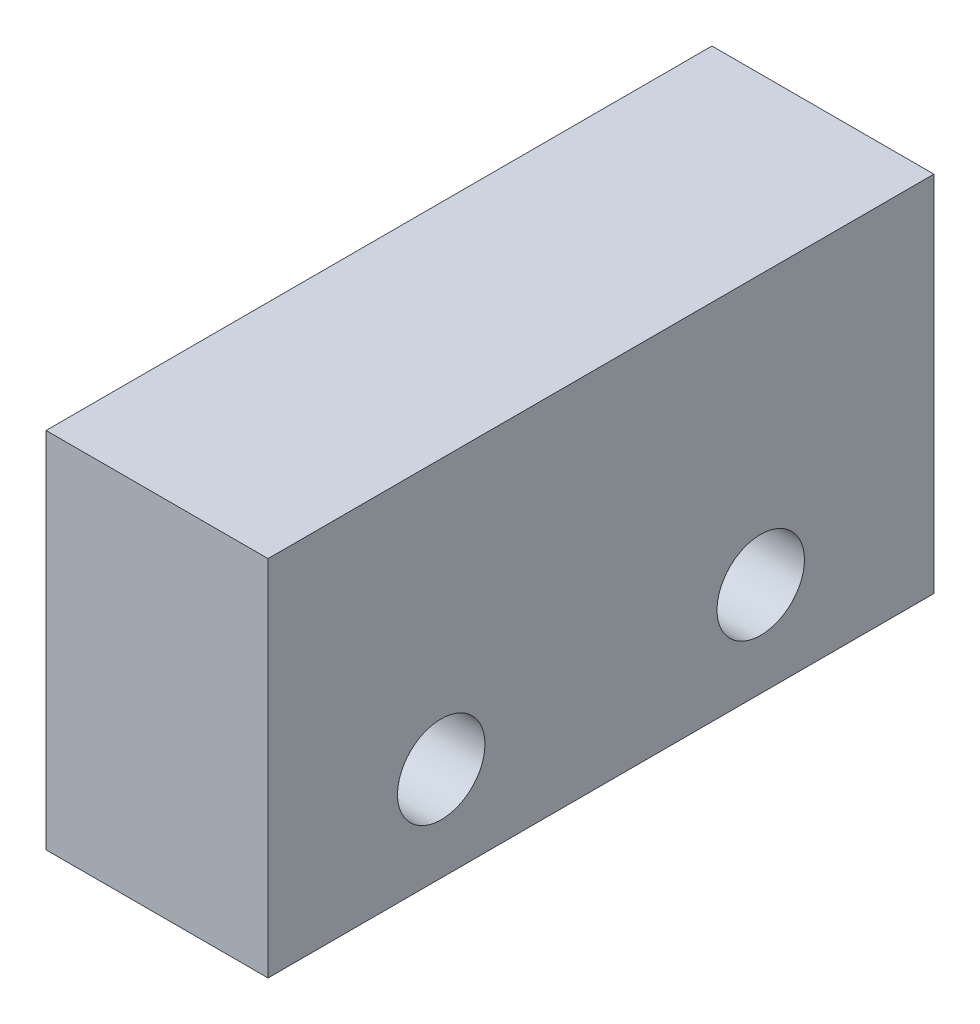
ISO-10303-21;
HEADER;
FILE_DESCRIPTION(('STEP AP214'),'2;1');
FILE_NAME('part.step','',(''),(''),'','','');
FILE_SCHEMA(('AUTOMOTIVE_DESIGN { 1 0 10303 214 1 1 1 1 }'));
ENDSEC;
DATA;
#1=APPLICATION_CONTEXT('core data for automotive mechanical design processes');
#2=APPLICATION_PROTOCOL_DEFINITION('international standard','automotive_design',2000,#1);
#3=PRODUCT_CONTEXT('',#1,'mechanical');
#4=PRODUCT('Part','Part','',(#3));
#5=PRODUCT_RELATED_PRODUCT_CATEGORY('part','',(#4));
#6=PRODUCT_DEFINITION_FORMATION('','',#4);
#7=PRODUCT_DEFINITION_CONTEXT('part definition',#1,'design');
#8=PRODUCT_DEFINITION('design','',#6,#7);
#9=PRODUCT_DEFINITION_SHAPE('','',#8);
#10=(LENGTH_UNIT() NAMED_UNIT(*) SI_UNIT(.MILLI.,.METRE.));
#11=(NAMED_UNIT(*) PLANE_ANGLE_UNIT() SI_UNIT($,.RADIAN.));
#12=(NAMED_UNIT(*) SI_UNIT($,.STERADIAN.) SOLID_ANGLE_UNIT());
#13=UNCERTAINTY_MEASURE_WITH_UNIT(LENGTH_MEASURE(1.E-05),#10,'distance_accuracy_value','');
#14=(GEOMETRIC_REPRESENTATION_CONTEXT(3) GLOBAL_UNCERTAINTY_ASSIGNED_CONTEXT((#13)) GLOBAL_UNIT_ASSIGNED_CONTEXT((#10,
#11,#12)) REPRESENTATION_CONTEXT('',''));
#15=CARTESIAN_POINT('',(0.,0.,0.));
#16=DIRECTION('',(0.,0.,1.));
#17=DIRECTION('',(1.,0.,0.));
#18=AXIS2_PLACEMENT_3D('',#15,#16,#17);
#19=CARTESIAN_POINT('',(6.6,0.,0.));
#20=DIRECTION('',(0.,0.,-1.));
#21=DIRECTION('',(0.,1.,0.));
#22=AXIS2_PLACEMENT_3D('',#19,#20,#21);
#23=PLANE('',#22);
#24=DIRECTION('',(0.,-1.,0.));
#25=VECTOR('',#24,1.);
#26=CARTESIAN_POINT('',(0.,0.,0.));
#27=LINE('',#26,#25);
#28=CARTESIAN_POINT('',(0.,0.,0.));
#29=VERTEX_POINT('',#28);
#30=CARTESIAN_POINT('',(0.,-10.8,0.));
#31=VERTEX_POINT('',#30);
#32=EDGE_CURVE('E98',#29,#31,#27,.T.);
#33=ORIENTED_EDGE('',*,*,#32,.T.);
#34=DIRECTION('',(-1.,0.,0.));
#35=VECTOR('',#34,1.);
#36=CARTESIAN_POINT('',(6.6,-10.8,0.));
#37=LINE('',#36,#35);
#38=CARTESIAN_POINT('',(6.6,-10.8,0.));
#39=VERTEX_POINT('',#38);
#40=EDGE_CURVE('E11',#39,#31,#37,.T.);
#41=ORIENTED_EDGE('',*,*,#40,.F.);
#42=DIRECTION('',(0.,-1.,0.));
#43=VECTOR('',#42,1.);
#44=CARTESIAN_POINT('',(6.6,0.,0.));
#45=LINE('',#44,#43);
#46=CARTESIAN_POINT('',(6.6,0.,0.));
#47=VERTEX_POINT('',#46);
#48=EDGE_CURVE('E86',#47,#39,#45,.T.);
#49=ORIENTED_EDGE('',*,*,#48,.F.);
#50=DIRECTION('',(-1.,0.,0.));
#51=VECTOR('',#50,1.);
#52=CARTESIAN_POINT('',(6.6,0.,0.));
#53=LINE('',#52,#51);
#54=EDGE_CURVE('E94',#47,#29,#53,.T.);
#55=ORIENTED_EDGE('',*,*,#54,.T.);
#56=EDGE_LOOP('',(#33,#41,#49,#55));
#57=FACE_BOUND('',#56,.T.);
#58=ADVANCED_FACE('F35',(#57),#23,.F.);
#59=CARTESIAN_POINT('',(6.6,-10.8,0.));
#60=DIRECTION('',(0.,1.,0.));
#61=DIRECTION('',(0.,0.,1.));
#62=AXIS2_PLACEMENT_3D('',#59,#60,#61);
#63=PLANE('',#62);
#64=DIRECTION('',(0.,0.,-1.));
#65=VECTOR('',#64,1.);
#66=CARTESIAN_POINT('',(0.,-10.8,0.));
#67=LINE('',#66,#65);
#68=CARTESIAN_POINT('',(0.,-10.8,-19.8));
#69=VERTEX_POINT('',#68);
#70=EDGE_CURVE('E90',#31,#69,#67,.T.);
#71=ORIENTED_EDGE('',*,*,#70,.T.);
#72=DIRECTION('',(-1.,0.,0.));
#73=VECTOR('',#72,1.);
#74=CARTESIAN_POINT('',(6.6,-10.8,-19.8));
#75=LINE('',#74,#73);
#76=CARTESIAN_POINT('',(6.6,-10.8,-19.8));
#77=VERTEX_POINT('',#76);
#78=EDGE_CURVE('E43',#77,#69,#75,.T.);
#79=ORIENTED_EDGE('',*,*,#78,.F.);
#80=DIRECTION('',(0.,0.,-1.));
#81=VECTOR('',#80,1.);
#82=CARTESIAN_POINT('',(6.6,-10.8,0.));
#83=LINE('',#82,#81);
#84=EDGE_CURVE('E81',#39,#77,#83,.T.);
#85=ORIENTED_EDGE('',*,*,#84,.F.);
#86=ORIENTED_EDGE('',*,*,#40,.T.);
#87=EDGE_LOOP('',(#71,#79,#85,#86));
#88=FACE_BOUND('',#87,.T.);
#89=ADVANCED_FACE('F89',(#88),#63,.F.);
#90=CARTESIAN_POINT('',(6.6,0.,-19.8));
#91=DIRECTION('',(0.,0.,1.));
#92=DIRECTION('',(1.,0.,0.));
#93=AXIS2_PLACEMENT_3D('',#90,#91,#92);
#94=PLANE('',#93);
#95=DIRECTION('',(0.,1.,0.));
#96=VECTOR('',#95,1.);
#97=CARTESIAN_POINT('',(0.,0.,-19.8));
#98=LINE('',#97,#96);
#99=CARTESIAN_POINT('',(0.,0.,-19.8));
#100=VERTEX_POINT('',#99);
#101=EDGE_CURVE('E68',#69,#100,#98,.T.);
#102=ORIENTED_EDGE('',*,*,#101,.T.);
#103=DIRECTION('',(-1.,0.,0.));
#104=VECTOR('',#103,1.);
#105=CARTESIAN_POINT('',(6.6,0.,-19.8));
#106=LINE('',#105,#104);
#107=CARTESIAN_POINT('',(6.6,0.,-19.8));
#108=VERTEX_POINT('',#107);
#109=EDGE_CURVE('E91',#108,#100,#106,.T.);
#110=ORIENTED_EDGE('',*,*,#109,.F.);
#111=DIRECTION('',(0.,1.,0.));
#112=VECTOR('',#111,1.);
#113=CARTESIAN_POINT('',(6.6,0.,-19.8));
#114=LINE('',#113,#112);
#115=EDGE_CURVE('E84',#77,#108,#114,.T.);
#116=ORIENTED_EDGE('',*,*,#115,.F.);
#117=ORIENTED_EDGE('',*,*,#78,.T.);
#118=EDGE_LOOP('',(#102,#110,#116,#117));
#119=FACE_BOUND('',#118,.T.);
#120=ADVANCED_FACE('F92',(#119),#94,.F.);
#121=CARTESIAN_POINT('',(6.6,0.,0.));
#122=DIRECTION('',(0.,-1.,0.));
#123=DIRECTION('',(0.,0.,-1.));
#124=AXIS2_PLACEMENT_3D('',#121,#122,#123);
#125=PLANE('',#124);
#126=DIRECTION('',(0.,0.,1.));
#127=VECTOR('',#126,1.);
#128=CARTESIAN_POINT('',(0.,0.,0.));
#129=LINE('',#128,#127);
#130=EDGE_CURVE('E74',#100,#29,#129,.T.);
#131=ORIENTED_EDGE('',*,*,#130,.T.);
#132=ORIENTED_EDGE('',*,*,#54,.F.);
#133=DIRECTION('',(0.,0.,1.));
#134=VECTOR('',#133,1.);
#135=CARTESIAN_POINT('',(6.6,0.,0.));
#136=LINE('',#135,#134);
#137=EDGE_CURVE('E51',#108,#47,#136,.T.);
#138=ORIENTED_EDGE('',*,*,#137,.F.);
#139=ORIENTED_EDGE('',*,*,#109,.T.);
#140=EDGE_LOOP('',(#131,#132,#138,#139));
#141=FACE_BOUND('',#140,.T.);
#142=ADVANCED_FACE('F106',(#141),#125,.F.);
#143=CARTESIAN_POINT('',(6.6,0.,0.));
#144=DIRECTION('',(1.,0.,0.));
#145=DIRECTION('',(0.,0.,-1.));
#146=AXIS2_PLACEMENT_3D('',#143,#144,#145);
#147=PLANE('',#146);
#148=CARTESIAN_POINT('',(6.6,-8.,-14.65));
#149=DIRECTION('',(1.,0.,0.));
#150=DIRECTION('',(0.,0.,-1.));
#151=AXIS2_PLACEMENT_3D('',#148,#149,#150);
#152=CIRCLE('',#151,1.3);
#153=CARTESIAN_POINT('',(6.6,-8.,-15.95));
#154=VERTEX_POINT('',#153);
#155=EDGE_CURVE('E118',#154,#154,#152,.T.);
#156=ORIENTED_EDGE('',*,*,#155,.F.);
#157=EDGE_LOOP('',(#156));
#158=FACE_BOUND('',#157,.T.);
#159=CARTESIAN_POINT('',(6.6,-8.,-5.15));
#160=DIRECTION('',(1.,0.,0.));
#161=DIRECTION('',(0.,0.,-1.));
#162=AXIS2_PLACEMENT_3D('',#159,#160,#161);
#163=CIRCLE('',#162,1.3);
#164=CARTESIAN_POINT('',(6.6,-8.,-6.45));
#165=VERTEX_POINT('',#164);
#166=EDGE_CURVE('E112',#165,#165,#163,.T.);
#167=ORIENTED_EDGE('',*,*,#166,.F.);
#168=EDGE_LOOP('',(#167));
#169=FACE_BOUND('',#168,.T.);
#170=ORIENTED_EDGE('',*,*,#48,.T.);
#171=ORIENTED_EDGE('',*,*,#84,.T.);
#172=ORIENTED_EDGE('',*,*,#115,.T.);
#173=ORIENTED_EDGE('',*,*,#137,.T.);
#174=EDGE_LOOP('',(#170,#171,#172,#173));
#175=FACE_BOUND('',#174,.T.);
#176=ADVANCED_FACE('F82',(#158,#169,#175),#147,.T.);
#177=CARTESIAN_POINT('',(0.,0.,0.));
#178=DIRECTION('',(1.,0.,0.));
#179=DIRECTION('',(0.,0.,-1.));
#180=AXIS2_PLACEMENT_3D('',#177,#178,#179);
#181=PLANE('',#180);
#182=CARTESIAN_POINT('',(0.,-8.,-14.65));
#183=DIRECTION('',(1.,0.,0.));
#184=DIRECTION('',(0.,0.,-1.));
#185=AXIS2_PLACEMENT_3D('',#182,#183,#184);
#186=CIRCLE('',#185,1.3);
#187=CARTESIAN_POINT('',(0.,-8.,-15.95));
#188=VERTEX_POINT('',#187);
#189=EDGE_CURVE('E115',#188,#188,#186,.T.);
#190=ORIENTED_EDGE('',*,*,#189,.T.);
#191=EDGE_LOOP('',(#190));
#192=FACE_BOUND('',#191,.T.);
#193=CARTESIAN_POINT('',(0.,-8.,-5.15));
#194=DIRECTION('',(1.,0.,0.));
#195=DIRECTION('',(0.,0.,-1.));
#196=AXIS2_PLACEMENT_3D('',#193,#194,#195);
#197=CIRCLE('',#196,1.3);
#198=CARTESIAN_POINT('',(0.,-8.,-6.45));
#199=VERTEX_POINT('',#198);
#200=EDGE_CURVE('E101',#199,#199,#197,.T.);
#201=ORIENTED_EDGE('',*,*,#200,.T.);
#202=EDGE_LOOP('',(#201));
#203=FACE_BOUND('',#202,.T.);
#204=ORIENTED_EDGE('',*,*,#32,.F.);
#205=ORIENTED_EDGE('',*,*,#130,.F.);
#206=ORIENTED_EDGE('',*,*,#101,.F.);
#207=ORIENTED_EDGE('',*,*,#70,.F.);
#208=EDGE_LOOP('',(#204,#205,#206,#207));
#209=FACE_BOUND('',#208,.T.);
#210=ADVANCED_FACE('F109',(#192,#203,#209),#181,.F.);
#211=CARTESIAN_POINT('',(0.,-8.,-5.15));
#212=DIRECTION('',(1.,0.,0.));
#213=DIRECTION('',(0.,0.,-1.));
#214=AXIS2_PLACEMENT_3D('',#211,#212,#213);
#215=CYLINDRICAL_SURFACE('',#214,1.3);
#216=ORIENTED_EDGE('',*,*,#200,.F.);
#217=EDGE_LOOP('',(#216));
#218=FACE_BOUND('',#217,.T.);
#219=ORIENTED_EDGE('',*,*,#166,.T.);
#220=EDGE_LOOP('',(#219));
#221=FACE_BOUND('',#220,.T.);
#222=ADVANCED_FACE('F129',(#218,#221),#215,.F.);
#223=CARTESIAN_POINT('',(0.,-8.,-14.65));
#224=DIRECTION('',(1.,0.,0.));
#225=DIRECTION('',(0.,0.,-1.));
#226=AXIS2_PLACEMENT_3D('',#223,#224,#225);
#227=CYLINDRICAL_SURFACE('',#226,1.3);
#228=ORIENTED_EDGE('',*,*,#189,.F.);
#229=EDGE_LOOP('',(#228));
#230=FACE_BOUND('',#229,.T.);
#231=ORIENTED_EDGE('',*,*,#155,.T.);
#232=EDGE_LOOP('',(#231));
#233=FACE_BOUND('',#232,.T.);
#234=ADVANCED_FACE('F126',(#230,#233),#227,.F.);
#235=CLOSED_SHELL('',(#58,#89,#120,#142,#176,#210,#222,#234));
#236=MANIFOLD_SOLID_BREP('B2',#235);
#237=ADVANCED_BREP_SHAPE_REPRESENTATION('',(#18,#236),#14);
#238=SHAPE_DEFINITION_REPRESENTATION(#9,#237);
ENDSEC;
END-ISO-10303-21;
